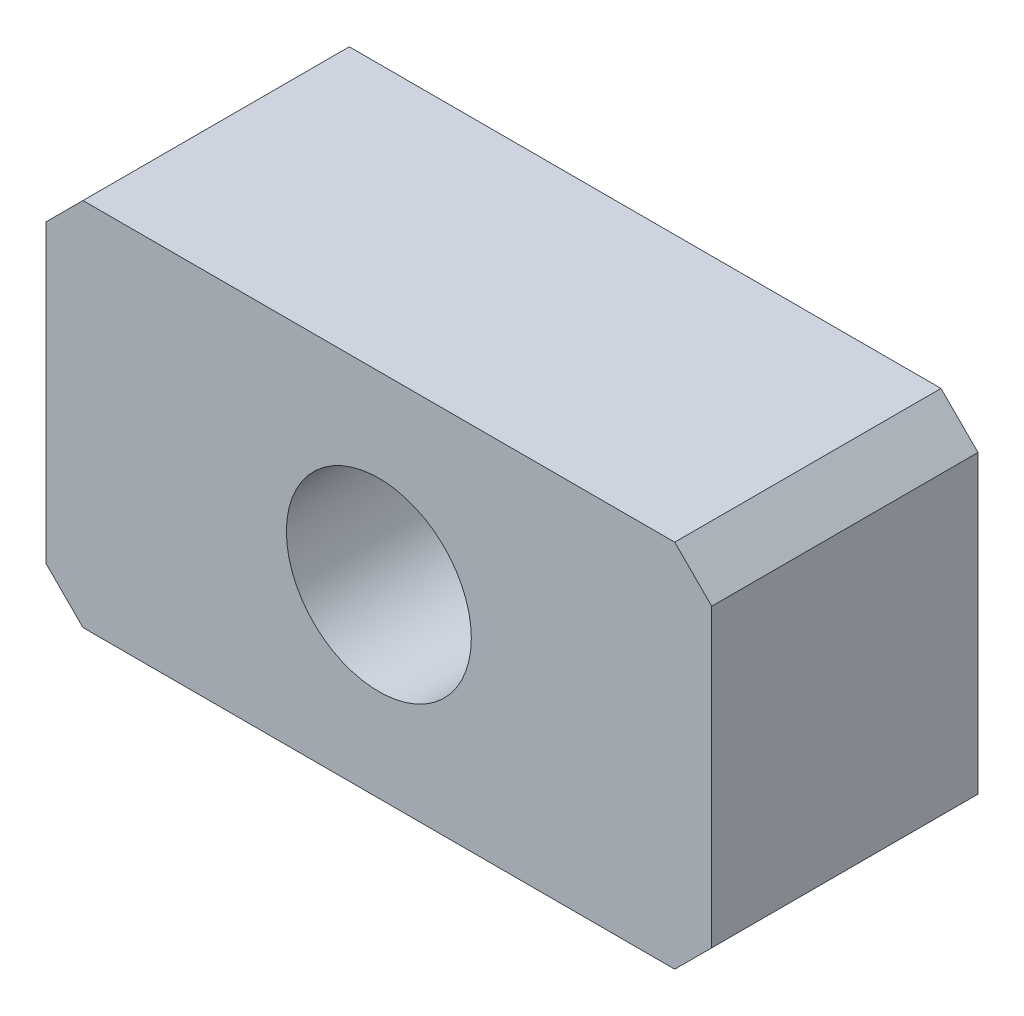
ISO-10303-21;
HEADER;
FILE_DESCRIPTION(('STEP AP214'),'2;1');
FILE_NAME('part.step','',(''),(''),'','','');
FILE_SCHEMA(('AUTOMOTIVE_DESIGN { 1 0 10303 214 1 1 1 1 }'));
ENDSEC;
DATA;
#1=APPLICATION_CONTEXT('core data for automotive mechanical design processes');
#2=APPLICATION_PROTOCOL_DEFINITION('international standard','automotive_design',2000,#1);
#3=PRODUCT_CONTEXT('',#1,'mechanical');
#4=PRODUCT('Part','Part','',(#3));
#5=PRODUCT_RELATED_PRODUCT_CATEGORY('part','',(#4));
#6=PRODUCT_DEFINITION_FORMATION('','',#4);
#7=PRODUCT_DEFINITION_CONTEXT('part definition',#1,'design');
#8=PRODUCT_DEFINITION('design','',#6,#7);
#9=PRODUCT_DEFINITION_SHAPE('','',#8);
#10=(LENGTH_UNIT() NAMED_UNIT(*) SI_UNIT(.MILLI.,.METRE.));
#11=(NAMED_UNIT(*) PLANE_ANGLE_UNIT() SI_UNIT($,.RADIAN.));
#12=(NAMED_UNIT(*) SI_UNIT($,.STERADIAN.) SOLID_ANGLE_UNIT());
#13=UNCERTAINTY_MEASURE_WITH_UNIT(LENGTH_MEASURE(1.E-05),#10,'distance_accuracy_value','');
#14=(GEOMETRIC_REPRESENTATION_CONTEXT(3) GLOBAL_UNCERTAINTY_ASSIGNED_CONTEXT((#13)) GLOBAL_UNIT_ASSIGNED_CONTEXT((#10,
#11,#12)) REPRESENTATION_CONTEXT('',''));
#15=CARTESIAN_POINT('',(0.,0.,0.));
#16=DIRECTION('',(0.,0.,1.));
#17=DIRECTION('',(1.,0.,0.));
#18=AXIS2_PLACEMENT_3D('',#15,#16,#17);
#19=CARTESIAN_POINT('',(6.5,6.5,7.2));
#20=DIRECTION('',(0.707106781186547,0.707106781186548,0.));
#21=DIRECTION('',(-0.707106781186548,0.707106781186547,0.));
#22=AXIS2_PLACEMENT_3D('',#19,#20,#21);
#23=PLANE('',#22);
#24=DIRECTION('',(0.707106781186548,-0.707106781186547,0.));
#25=VECTOR('',#24,1.);
#26=CARTESIAN_POINT('',(6.5,6.5,0.));
#27=LINE('',#26,#25);
#28=CARTESIAN_POINT('',(8.,5.,0.));
#29=VERTEX_POINT('',#28);
#30=CARTESIAN_POINT('',(9.,4.,0.));
#31=VERTEX_POINT('',#30);
#32=EDGE_CURVE('E139',#29,#31,#27,.T.);
#33=ORIENTED_EDGE('',*,*,#32,.F.);
#34=DIRECTION('',(0.,0.,-1.));
#35=VECTOR('',#34,1.);
#36=CARTESIAN_POINT('',(8.,5.,7.2));
#37=LINE('',#36,#35);
#38=CARTESIAN_POINT('',(8.,5.,7.2));
#39=VERTEX_POINT('',#38);
#40=EDGE_CURVE('E11',#39,#29,#37,.T.);
#41=ORIENTED_EDGE('',*,*,#40,.F.);
#42=DIRECTION('',(0.707106781186548,-0.707106781186547,0.));
#43=VECTOR('',#42,1.);
#44=CARTESIAN_POINT('',(6.5,6.5,7.2));
#45=LINE('',#44,#43);
#46=CARTESIAN_POINT('',(9.,4.,7.2));
#47=VERTEX_POINT('',#46);
#48=EDGE_CURVE('E166',#39,#47,#45,.T.);
#49=ORIENTED_EDGE('',*,*,#48,.T.);
#50=DIRECTION('',(0.,0.,-1.));
#51=VECTOR('',#50,1.);
#52=CARTESIAN_POINT('',(9.,4.,7.2));
#53=LINE('',#52,#51);
#54=EDGE_CURVE('E94',#47,#31,#53,.T.);
#55=ORIENTED_EDGE('',*,*,#54,.T.);
#56=EDGE_LOOP('',(#33,#41,#49,#55));
#57=FACE_BOUND('',#56,.T.);
#58=ADVANCED_FACE('F41',(#57),#23,.T.);
#59=CARTESIAN_POINT('',(0.,5.,7.2));
#60=DIRECTION('',(0.,1.,0.));
#61=DIRECTION('',(0.,0.,1.));
#62=AXIS2_PLACEMENT_3D('',#59,#60,#61);
#63=PLANE('',#62);
#64=DIRECTION('',(1.,0.,0.));
#65=VECTOR('',#64,1.);
#66=CARTESIAN_POINT('',(0.,5.,0.));
#67=LINE('',#66,#65);
#68=CARTESIAN_POINT('',(-8.,5.,0.));
#69=VERTEX_POINT('',#68);
#70=EDGE_CURVE('E143',#69,#29,#67,.T.);
#71=ORIENTED_EDGE('',*,*,#70,.F.);
#72=DIRECTION('',(0.,0.,-1.));
#73=VECTOR('',#72,1.);
#74=CARTESIAN_POINT('',(-8.,5.,7.2));
#75=LINE('',#74,#73);
#76=CARTESIAN_POINT('',(-8.,5.,7.2));
#77=VERTEX_POINT('',#76);
#78=EDGE_CURVE('E51',#77,#69,#75,.T.);
#79=ORIENTED_EDGE('',*,*,#78,.F.);
#80=DIRECTION('',(1.,0.,0.));
#81=VECTOR('',#80,1.);
#82=CARTESIAN_POINT('',(0.,5.,7.2));
#83=LINE('',#82,#81);
#84=EDGE_CURVE('E194',#77,#39,#83,.T.);
#85=ORIENTED_EDGE('',*,*,#84,.T.);
#86=ORIENTED_EDGE('',*,*,#40,.T.);
#87=EDGE_LOOP('',(#71,#79,#85,#86));
#88=FACE_BOUND('',#87,.T.);
#89=ADVANCED_FACE('F193',(#88),#63,.T.);
#90=CARTESIAN_POINT('',(-6.5,6.5,7.2));
#91=DIRECTION('',(0.707106781186547,-0.707106781186548,0.));
#92=DIRECTION('',(0.707106781186548,0.707106781186547,0.));
#93=AXIS2_PLACEMENT_3D('',#90,#91,#92);
#94=PLANE('',#93);
#95=DIRECTION('',(-0.707106781186548,-0.707106781186547,0.));
#96=VECTOR('',#95,1.);
#97=CARTESIAN_POINT('',(-6.5,6.5,0.));
#98=LINE('',#97,#96);
#99=CARTESIAN_POINT('',(-9.,4.,0.));
#100=VERTEX_POINT('',#99);
#101=EDGE_CURVE('E147',#69,#100,#98,.T.);
#102=ORIENTED_EDGE('',*,*,#101,.T.);
#103=DIRECTION('',(0.,0.,-1.));
#104=VECTOR('',#103,1.);
#105=CARTESIAN_POINT('',(-9.,4.,7.2));
#106=LINE('',#105,#104);
#107=CARTESIAN_POINT('',(-9.,4.,7.2));
#108=VERTEX_POINT('',#107);
#109=EDGE_CURVE('E176',#108,#100,#106,.T.);
#110=ORIENTED_EDGE('',*,*,#109,.F.);
#111=DIRECTION('',(-0.707106781186548,-0.707106781186547,0.));
#112=VECTOR('',#111,1.);
#113=CARTESIAN_POINT('',(-6.5,6.5,7.2));
#114=LINE('',#113,#112);
#115=EDGE_CURVE('E185',#77,#108,#114,.T.);
#116=ORIENTED_EDGE('',*,*,#115,.F.);
#117=ORIENTED_EDGE('',*,*,#78,.T.);
#118=EDGE_LOOP('',(#102,#110,#116,#117));
#119=FACE_BOUND('',#118,.T.);
#120=ADVANCED_FACE('F183',(#119),#94,.F.);
#121=CARTESIAN_POINT('',(-9.,0.,7.2));
#122=DIRECTION('',(-1.,0.,0.));
#123=DIRECTION('',(0.,0.,1.));
#124=AXIS2_PLACEMENT_3D('',#121,#122,#123);
#125=PLANE('',#124);
#126=DIRECTION('',(0.,1.,0.));
#127=VECTOR('',#126,1.);
#128=CARTESIAN_POINT('',(-9.,0.,0.));
#129=LINE('',#128,#127);
#130=CARTESIAN_POINT('',(-9.,-4.,0.));
#131=VERTEX_POINT('',#130);
#132=EDGE_CURVE('E151',#131,#100,#129,.T.);
#133=ORIENTED_EDGE('',*,*,#132,.F.);
#134=DIRECTION('',(0.,0.,-1.));
#135=VECTOR('',#134,1.);
#136=CARTESIAN_POINT('',(-9.,-4.,7.2));
#137=LINE('',#136,#135);
#138=CARTESIAN_POINT('',(-9.,-4.,7.2));
#139=VERTEX_POINT('',#138);
#140=EDGE_CURVE('E173',#139,#131,#137,.T.);
#141=ORIENTED_EDGE('',*,*,#140,.F.);
#142=DIRECTION('',(0.,1.,0.));
#143=VECTOR('',#142,1.);
#144=CARTESIAN_POINT('',(-9.,0.,7.2));
#145=LINE('',#144,#143);
#146=EDGE_CURVE('E207',#139,#108,#145,.T.);
#147=ORIENTED_EDGE('',*,*,#146,.T.);
#148=ORIENTED_EDGE('',*,*,#109,.T.);
#149=EDGE_LOOP('',(#133,#141,#147,#148));
#150=FACE_BOUND('',#149,.T.);
#151=ADVANCED_FACE('F215',(#150),#125,.T.);
#152=CARTESIAN_POINT('',(-6.5,-6.5,7.2));
#153=DIRECTION('',(-0.707106781186547,-0.707106781186548,0.));
#154=DIRECTION('',(0.707106781186548,-0.707106781186547,0.));
#155=AXIS2_PLACEMENT_3D('',#152,#153,#154);
#156=PLANE('',#155);
#157=DIRECTION('',(-0.707106781186548,0.707106781186547,0.));
#158=VECTOR('',#157,1.);
#159=CARTESIAN_POINT('',(-6.5,-6.5,0.));
#160=LINE('',#159,#158);
#161=CARTESIAN_POINT('',(-8.,-5.,0.));
#162=VERTEX_POINT('',#161);
#163=EDGE_CURVE('E155',#162,#131,#160,.T.);
#164=ORIENTED_EDGE('',*,*,#163,.F.);
#165=DIRECTION('',(0.,0.,-1.));
#166=VECTOR('',#165,1.);
#167=CARTESIAN_POINT('',(-8.,-5.,7.2));
#168=LINE('',#167,#166);
#169=CARTESIAN_POINT('',(-8.,-5.,7.2));
#170=VERTEX_POINT('',#169);
#171=EDGE_CURVE('E129',#170,#162,#168,.T.);
#172=ORIENTED_EDGE('',*,*,#171,.F.);
#173=DIRECTION('',(-0.707106781186548,0.707106781186547,0.));
#174=VECTOR('',#173,1.);
#175=CARTESIAN_POINT('',(-6.5,-6.5,7.2));
#176=LINE('',#175,#174);
#177=EDGE_CURVE('E120',#170,#139,#176,.T.);
#178=ORIENTED_EDGE('',*,*,#177,.T.);
#179=ORIENTED_EDGE('',*,*,#140,.T.);
#180=EDGE_LOOP('',(#164,#172,#178,#179));
#181=FACE_BOUND('',#180,.T.);
#182=ADVANCED_FACE('F213',(#181),#156,.T.);
#183=CARTESIAN_POINT('',(0.,-5.,7.2));
#184=DIRECTION('',(0.,1.,0.));
#185=DIRECTION('',(0.,0.,1.));
#186=AXIS2_PLACEMENT_3D('',#183,#184,#185);
#187=PLANE('',#186);
#188=DIRECTION('',(1.,0.,0.));
#189=VECTOR('',#188,1.);
#190=CARTESIAN_POINT('',(0.,-5.,0.));
#191=LINE('',#190,#189);
#192=CARTESIAN_POINT('',(8.,-5.,0.));
#193=VERTEX_POINT('',#192);
#194=EDGE_CURVE('E127',#162,#193,#191,.T.);
#195=ORIENTED_EDGE('',*,*,#194,.T.);
#196=DIRECTION('',(0.,0.,-1.));
#197=VECTOR('',#196,1.);
#198=CARTESIAN_POINT('',(8.,-5.,7.2));
#199=LINE('',#198,#197);
#200=CARTESIAN_POINT('',(8.,-5.,7.2));
#201=VERTEX_POINT('',#200);
#202=EDGE_CURVE('E124',#201,#193,#199,.T.);
#203=ORIENTED_EDGE('',*,*,#202,.F.);
#204=DIRECTION('',(1.,0.,0.));
#205=VECTOR('',#204,1.);
#206=CARTESIAN_POINT('',(0.,-5.,7.2));
#207=LINE('',#206,#205);
#208=EDGE_CURVE('E113',#170,#201,#207,.T.);
#209=ORIENTED_EDGE('',*,*,#208,.F.);
#210=ORIENTED_EDGE('',*,*,#171,.T.);
#211=EDGE_LOOP('',(#195,#203,#209,#210));
#212=FACE_BOUND('',#211,.T.);
#213=ADVANCED_FACE('F125',(#212),#187,.F.);
#214=CARTESIAN_POINT('',(6.5,-6.5,7.2));
#215=DIRECTION('',(-0.707106781186547,0.707106781186548,0.));
#216=DIRECTION('',(-0.707106781186548,-0.707106781186547,0.));
#217=AXIS2_PLACEMENT_3D('',#214,#215,#216);
#218=PLANE('',#217);
#219=DIRECTION('',(0.707106781186548,0.707106781186547,0.));
#220=VECTOR('',#219,1.);
#221=CARTESIAN_POINT('',(6.5,-6.5,0.));
#222=LINE('',#221,#220);
#223=CARTESIAN_POINT('',(9.,-4.,0.));
#224=VERTEX_POINT('',#223);
#225=EDGE_CURVE('E87',#193,#224,#222,.T.);
#226=ORIENTED_EDGE('',*,*,#225,.T.);
#227=DIRECTION('',(0.,0.,-1.));
#228=VECTOR('',#227,1.);
#229=CARTESIAN_POINT('',(9.,-4.,7.2));
#230=LINE('',#229,#228);
#231=CARTESIAN_POINT('',(9.,-4.,7.2));
#232=VERTEX_POINT('',#231);
#233=EDGE_CURVE('E130',#232,#224,#230,.T.);
#234=ORIENTED_EDGE('',*,*,#233,.F.);
#235=DIRECTION('',(0.707106781186548,0.707106781186547,0.));
#236=VECTOR('',#235,1.);
#237=CARTESIAN_POINT('',(6.5,-6.5,7.2));
#238=LINE('',#237,#236);
#239=EDGE_CURVE('E117',#201,#232,#238,.T.);
#240=ORIENTED_EDGE('',*,*,#239,.F.);
#241=ORIENTED_EDGE('',*,*,#202,.T.);
#242=EDGE_LOOP('',(#226,#234,#240,#241));
#243=FACE_BOUND('',#242,.T.);
#244=ADVANCED_FACE('F132',(#243),#218,.F.);
#245=CARTESIAN_POINT('',(9.,0.,7.2));
#246=DIRECTION('',(-1.,0.,0.));
#247=DIRECTION('',(0.,0.,1.));
#248=AXIS2_PLACEMENT_3D('',#245,#246,#247);
#249=PLANE('',#248);
#250=DIRECTION('',(0.,1.,0.));
#251=VECTOR('',#250,1.);
#252=CARTESIAN_POINT('',(9.,0.,0.));
#253=LINE('',#252,#251);
#254=EDGE_CURVE('E163',#224,#31,#253,.T.);
#255=ORIENTED_EDGE('',*,*,#254,.T.);
#256=ORIENTED_EDGE('',*,*,#54,.F.);
#257=DIRECTION('',(0.,1.,0.));
#258=VECTOR('',#257,1.);
#259=CARTESIAN_POINT('',(9.,0.,7.2));
#260=LINE('',#259,#258);
#261=EDGE_CURVE('E59',#232,#47,#260,.T.);
#262=ORIENTED_EDGE('',*,*,#261,.F.);
#263=ORIENTED_EDGE('',*,*,#233,.T.);
#264=EDGE_LOOP('',(#255,#256,#262,#263));
#265=FACE_BOUND('',#264,.T.);
#266=ADVANCED_FACE('F197',(#265),#249,.F.);
#267=CARTESIAN_POINT('',(0.,0.,7.2));
#268=DIRECTION('',(0.,0.,1.));
#269=DIRECTION('',(1.,0.,0.));
#270=AXIS2_PLACEMENT_3D('',#267,#268,#269);
#271=PLANE('',#270);
#272=CARTESIAN_POINT('',(0.,0.,7.2));
#273=DIRECTION('',(0.,0.,1.));
#274=DIRECTION('',(1.,0.,0.));
#275=AXIS2_PLACEMENT_3D('',#272,#273,#274);
#276=CIRCLE('',#275,2.5);
#277=CARTESIAN_POINT('',(2.5,0.,7.2));
#278=VERTEX_POINT('',#277);
#279=EDGE_CURVE('E203',#278,#278,#276,.T.);
#280=ORIENTED_EDGE('',*,*,#279,.F.);
#281=EDGE_LOOP('',(#280));
#282=FACE_BOUND('',#281,.T.);
#283=ORIENTED_EDGE('',*,*,#48,.F.);
#284=ORIENTED_EDGE('',*,*,#84,.F.);
#285=ORIENTED_EDGE('',*,*,#115,.T.);
#286=ORIENTED_EDGE('',*,*,#146,.F.);
#287=ORIENTED_EDGE('',*,*,#177,.F.);
#288=ORIENTED_EDGE('',*,*,#208,.T.);
#289=ORIENTED_EDGE('',*,*,#239,.T.);
#290=ORIENTED_EDGE('',*,*,#261,.T.);
#291=EDGE_LOOP('',(#283,#284,#285,#286,#287,#288,#289,#290));
#292=FACE_BOUND('',#291,.T.);
#293=ADVANCED_FACE('F115',(#282,#292),#271,.T.);
#294=CARTESIAN_POINT('',(0.,0.,0.));
#295=DIRECTION('',(0.,0.,1.));
#296=DIRECTION('',(1.,0.,0.));
#297=AXIS2_PLACEMENT_3D('',#294,#295,#296);
#298=PLANE('',#297);
#299=CARTESIAN_POINT('',(0.,0.,0.));
#300=DIRECTION('',(0.,0.,1.));
#301=DIRECTION('',(1.,0.,0.));
#302=AXIS2_PLACEMENT_3D('',#299,#300,#301);
#303=CIRCLE('',#302,2.5);
#304=CARTESIAN_POINT('',(2.5,0.,0.));
#305=VERTEX_POINT('',#304);
#306=EDGE_CURVE('E44',#305,#305,#303,.T.);
#307=ORIENTED_EDGE('',*,*,#306,.T.);
#308=EDGE_LOOP('',(#307));
#309=FACE_BOUND('',#308,.T.);
#310=ORIENTED_EDGE('',*,*,#32,.T.);
#311=ORIENTED_EDGE('',*,*,#254,.F.);
#312=ORIENTED_EDGE('',*,*,#225,.F.);
#313=ORIENTED_EDGE('',*,*,#194,.F.);
#314=ORIENTED_EDGE('',*,*,#163,.T.);
#315=ORIENTED_EDGE('',*,*,#132,.T.);
#316=ORIENTED_EDGE('',*,*,#101,.F.);
#317=ORIENTED_EDGE('',*,*,#70,.T.);
#318=EDGE_LOOP('',(#310,#311,#312,#313,#314,#315,#316,#317));
#319=FACE_BOUND('',#318,.T.);
#320=ADVANCED_FACE('F191',(#309,#319),#298,.F.);
#321=CARTESIAN_POINT('',(0.,0.,-2.8));
#322=DIRECTION('',(0.,0.,1.));
#323=DIRECTION('',(1.,0.,0.));
#324=AXIS2_PLACEMENT_3D('',#321,#322,#323);
#325=CYLINDRICAL_SURFACE('',#324,2.5);
#326=ORIENTED_EDGE('',*,*,#279,.T.);
#327=EDGE_LOOP('',(#326));
#328=FACE_BOUND('',#327,.T.);
#329=ORIENTED_EDGE('',*,*,#306,.F.);
#330=EDGE_LOOP('',(#329));
#331=FACE_BOUND('',#330,.T.);
#332=ADVANCED_FACE('F286',(#328,#331),#325,.F.);
#333=CLOSED_SHELL('',(#58,#89,#120,#151,#182,#213,#244,#266,#293,#320,#332));
#334=MANIFOLD_SOLID_BREP('B2',#333);
#335=ADVANCED_BREP_SHAPE_REPRESENTATION('',(#18,#334),#14);
#336=SHAPE_DEFINITION_REPRESENTATION(#9,#335);
ENDSEC;
END-ISO-10303-21;
